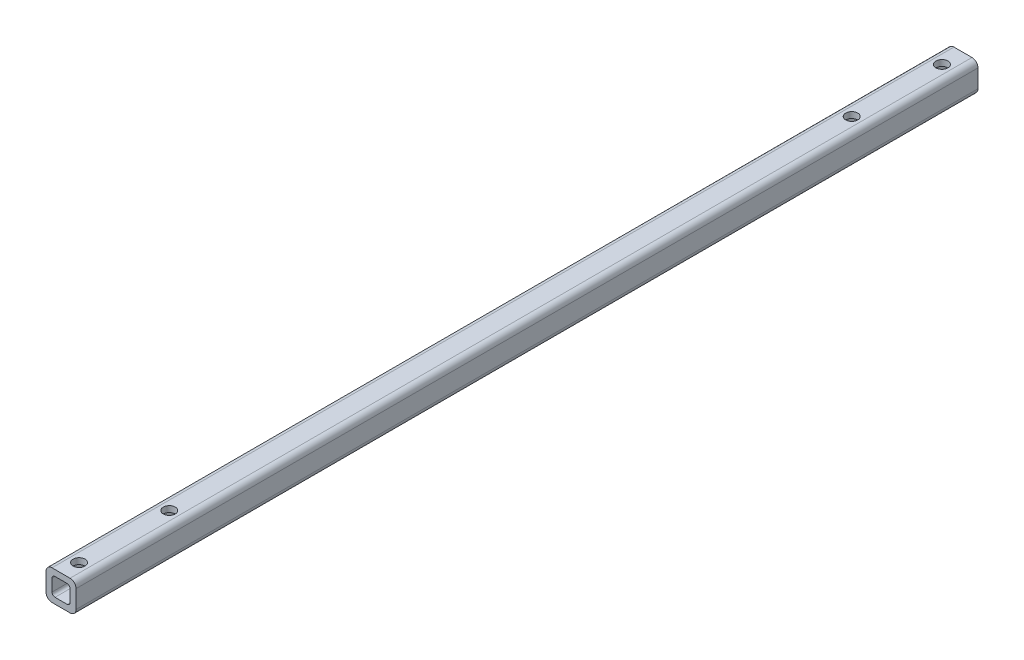
ISO-10303-21;
HEADER;
FILE_DESCRIPTION(('STEP AP214'),'2;1');
FILE_NAME('part.step','',(''),(''),'','','');
FILE_SCHEMA(('AUTOMOTIVE_DESIGN { 1 0 10303 214 1 1 1 1 }'));
ENDSEC;
DATA;
#1=APPLICATION_CONTEXT('core data for automotive mechanical design processes');
#2=APPLICATION_PROTOCOL_DEFINITION('international standard','automotive_design',2000,#1);
#3=PRODUCT_CONTEXT('',#1,'mechanical');
#4=PRODUCT('Part','Part','',(#3));
#5=PRODUCT_RELATED_PRODUCT_CATEGORY('part','',(#4));
#6=PRODUCT_DEFINITION_FORMATION('','',#4);
#7=PRODUCT_DEFINITION_CONTEXT('part definition',#1,'design');
#8=PRODUCT_DEFINITION('design','',#6,#7);
#9=PRODUCT_DEFINITION_SHAPE('','',#8);
#10=(LENGTH_UNIT() NAMED_UNIT(*) SI_UNIT(.MILLI.,.METRE.));
#11=(NAMED_UNIT(*) PLANE_ANGLE_UNIT() SI_UNIT($,.RADIAN.));
#12=(NAMED_UNIT(*) SI_UNIT($,.STERADIAN.) SOLID_ANGLE_UNIT());
#13=UNCERTAINTY_MEASURE_WITH_UNIT(LENGTH_MEASURE(1.E-05),#10,'distance_accuracy_value','');
#14=(GEOMETRIC_REPRESENTATION_CONTEXT(3) GLOBAL_UNCERTAINTY_ASSIGNED_CONTEXT((#13)) GLOBAL_UNIT_ASSIGNED_CONTEXT((#10,
#11,#12)) REPRESENTATION_CONTEXT('',''));
#15=CARTESIAN_POINT('',(0.,0.,0.));
#16=DIRECTION('',(0.,0.,1.));
#17=DIRECTION('',(1.,0.,0.));
#18=AXIS2_PLACEMENT_3D('',#15,#16,#17);
#19=CARTESIAN_POINT('',(3.00000000000001,8.,300.));
#20=DIRECTION('',(0.,-1.,0.));
#21=DIRECTION('',(0.,0.,-1.));
#22=AXIS2_PLACEMENT_3D('',#19,#20,#21);
#23=PLANE('',#22);
#24=CARTESIAN_POINT('',(5.,8.,37.));
#25=DIRECTION('',(0.,-1.,0.));
#26=DIRECTION('',(0.,0.,-1.));
#27=AXIS2_PLACEMENT_3D('',#24,#25,#26);
#28=CIRCLE('',#27,2.);
#29=CARTESIAN_POINT('',(6.99999999999999,8.,37.));
#30=VERTEX_POINT('',#29);
#31=CARTESIAN_POINT('',(3.00000000000001,8.,37.));
#32=VERTEX_POINT('',#31);
#33=EDGE_CURVE('E48',#30,#32,#28,.T.);
#34=ORIENTED_EDGE('',*,*,#33,.F.);
#35=DIRECTION('',(0.,0.,-1.));
#36=VECTOR('',#35,1.);
#37=CARTESIAN_POINT('',(6.99999999999999,8.,300.));
#38=LINE('',#37,#36);
#39=CARTESIAN_POINT('',(6.99999999999999,8.,264.));
#40=VERTEX_POINT('',#39);
#41=EDGE_CURVE('E391',#40,#30,#38,.T.);
#42=ORIENTED_EDGE('',*,*,#41,.F.);
#43=CARTESIAN_POINT('',(5.,8.,264.));
#44=DIRECTION('',(0.,-1.,0.));
#45=DIRECTION('',(0.,0.,-1.));
#46=AXIS2_PLACEMENT_3D('',#43,#44,#45);
#47=CIRCLE('',#46,2.);
#48=CARTESIAN_POINT('',(3.00000000000001,8.,264.));
#49=VERTEX_POINT('',#48);
#50=EDGE_CURVE('E292',#49,#40,#47,.T.);
#51=ORIENTED_EDGE('',*,*,#50,.F.);
#52=DIRECTION('',(0.,0.,-1.));
#53=VECTOR('',#52,1.);
#54=CARTESIAN_POINT('',(3.00000000000001,8.,300.));
#55=LINE('',#54,#53);
#56=EDGE_CURVE('E408',#49,#32,#55,.T.);
#57=ORIENTED_EDGE('',*,*,#56,.T.);
#58=EDGE_LOOP('',(#34,#42,#51,#57));
#59=FACE_BOUND('',#58,.T.);
#60=ADVANCED_FACE('F34',(#59),#23,.T.);
#61=CARTESIAN_POINT('',(3.00000000000001,2.,300.));
#62=DIRECTION('',(0.,1.,0.));
#63=DIRECTION('',(0.,0.,1.));
#64=AXIS2_PLACEMENT_3D('',#61,#62,#63);
#65=PLANE('',#64);
#66=CARTESIAN_POINT('',(5.,2.,37.));
#67=DIRECTION('',(0.,1.,0.));
#68=DIRECTION('',(0.,0.,1.));
#69=AXIS2_PLACEMENT_3D('',#66,#67,#68);
#70=CIRCLE('',#69,2.);
#71=CARTESIAN_POINT('',(6.99999999999999,2.,37.));
#72=VERTEX_POINT('',#71);
#73=CARTESIAN_POINT('',(3.00000000000001,2.,37.));
#74=VERTEX_POINT('',#73);
#75=EDGE_CURVE('E55',#72,#74,#70,.T.);
#76=ORIENTED_EDGE('',*,*,#75,.F.);
#77=DIRECTION('',(0.,0.,-1.));
#78=VECTOR('',#77,1.);
#79=CARTESIAN_POINT('',(6.99999999999999,2.,300.));
#80=LINE('',#79,#78);
#81=CARTESIAN_POINT('',(6.99999999999999,2.,7.00000000000001));
#82=VERTEX_POINT('',#81);
#83=EDGE_CURVE('E205',#72,#82,#80,.T.);
#84=ORIENTED_EDGE('',*,*,#83,.T.);
#85=CARTESIAN_POINT('',(5.,2.,7.));
#86=DIRECTION('',(0.,1.,0.));
#87=DIRECTION('',(0.,0.,1.));
#88=AXIS2_PLACEMENT_3D('',#85,#86,#87);
#89=CIRCLE('',#88,2.);
#90=CARTESIAN_POINT('',(3.00000000000001,2.,7.00000000000001));
#91=VERTEX_POINT('',#90);
#92=EDGE_CURVE('E301',#91,#82,#89,.T.);
#93=ORIENTED_EDGE('',*,*,#92,.F.);
#94=DIRECTION('',(0.,0.,-1.));
#95=VECTOR('',#94,1.);
#96=CARTESIAN_POINT('',(3.00000000000001,2.,300.));
#97=LINE('',#96,#95);
#98=EDGE_CURVE('E207',#74,#91,#97,.T.);
#99=ORIENTED_EDGE('',*,*,#98,.F.);
#100=EDGE_LOOP('',(#76,#84,#93,#99));
#101=FACE_BOUND('',#100,.T.);
#102=ADVANCED_FACE('F203',(#101),#65,.T.);
#103=EDGE_CURVE('E298',#82,#91,#89,.T.);
#104=ORIENTED_EDGE('',*,*,#103,.F.);
#105=CARTESIAN_POINT('',(6.99999999999999,2.,0.));
#106=VERTEX_POINT('',#105);
#107=EDGE_CURVE('E218',#82,#106,#80,.T.);
#108=ORIENTED_EDGE('',*,*,#107,.T.);
#109=DIRECTION('',(1.,0.,0.));
#110=VECTOR('',#109,1.);
#111=CARTESIAN_POINT('',(3.00000000000001,2.,0.));
#112=LINE('',#111,#110);
#113=CARTESIAN_POINT('',(3.00000000000001,2.,0.));
#114=VERTEX_POINT('',#113);
#115=EDGE_CURVE('E245',#114,#106,#112,.T.);
#116=ORIENTED_EDGE('',*,*,#115,.F.);
#117=EDGE_CURVE('E429',#91,#114,#97,.T.);
#118=ORIENTED_EDGE('',*,*,#117,.F.);
#119=EDGE_LOOP('',(#104,#108,#116,#118));
#120=FACE_BOUND('',#119,.T.);
#121=ADVANCED_FACE('F341',(#120),#65,.T.);
#122=EDGE_CURVE('E209',#32,#30,#28,.T.);
#123=ORIENTED_EDGE('',*,*,#122,.F.);
#124=CARTESIAN_POINT('',(3.00000000000001,8.,7.00000000000001));
#125=VERTEX_POINT('',#124);
#126=EDGE_CURVE('E407',#32,#125,#55,.T.);
#127=ORIENTED_EDGE('',*,*,#126,.T.);
#128=CARTESIAN_POINT('',(5.,8.,7.));
#129=DIRECTION('',(0.,-1.,0.));
#130=DIRECTION('',(0.,0.,-1.));
#131=AXIS2_PLACEMENT_3D('',#128,#129,#130);
#132=CIRCLE('',#131,2.);
#133=CARTESIAN_POINT('',(6.99999999999999,8.,7.));
#134=VERTEX_POINT('',#133);
#135=EDGE_CURVE('E303',#134,#125,#132,.T.);
#136=ORIENTED_EDGE('',*,*,#135,.F.);
#137=EDGE_CURVE('E396',#30,#134,#38,.T.);
#138=ORIENTED_EDGE('',*,*,#137,.F.);
#139=EDGE_LOOP('',(#123,#127,#136,#138));
#140=FACE_BOUND('',#139,.T.);
#141=ADVANCED_FACE('F336',(#140),#23,.T.);
#142=EDGE_CURVE('E192',#74,#72,#70,.T.);
#143=ORIENTED_EDGE('',*,*,#142,.F.);
#144=CARTESIAN_POINT('',(3.00000000000001,2.,264.));
#145=VERTEX_POINT('',#144);
#146=EDGE_CURVE('E428',#145,#74,#97,.T.);
#147=ORIENTED_EDGE('',*,*,#146,.F.);
#148=CARTESIAN_POINT('',(5.,2.,264.));
#149=DIRECTION('',(0.,1.,0.));
#150=DIRECTION('',(0.,0.,1.));
#151=AXIS2_PLACEMENT_3D('',#148,#149,#150);
#152=CIRCLE('',#151,2.);
#153=CARTESIAN_POINT('',(6.99999999999999,2.,264.));
#154=VERTEX_POINT('',#153);
#155=EDGE_CURVE('E223',#154,#145,#152,.T.);
#156=ORIENTED_EDGE('',*,*,#155,.F.);
#157=EDGE_CURVE('E216',#154,#72,#80,.T.);
#158=ORIENTED_EDGE('',*,*,#157,.T.);
#159=EDGE_LOOP('',(#143,#147,#156,#158));
#160=FACE_BOUND('',#159,.T.);
#161=ADVANCED_FACE('F222',(#160),#65,.T.);
#162=EDGE_CURVE('E291',#40,#49,#47,.T.);
#163=ORIENTED_EDGE('',*,*,#162,.F.);
#164=CARTESIAN_POINT('',(6.99999999999999,8.,294.));
#165=VERTEX_POINT('',#164);
#166=EDGE_CURVE('E386',#165,#40,#38,.T.);
#167=ORIENTED_EDGE('',*,*,#166,.F.);
#168=CARTESIAN_POINT('',(5.,8.,294.));
#169=DIRECTION('',(0.,-1.,0.));
#170=DIRECTION('',(0.,0.,-1.));
#171=AXIS2_PLACEMENT_3D('',#168,#169,#170);
#172=CIRCLE('',#171,2.);
#173=CARTESIAN_POINT('',(3.00000000000001,8.,294.));
#174=VERTEX_POINT('',#173);
#175=EDGE_CURVE('E278',#174,#165,#172,.T.);
#176=ORIENTED_EDGE('',*,*,#175,.F.);
#177=EDGE_CURVE('E406',#174,#49,#55,.T.);
#178=ORIENTED_EDGE('',*,*,#177,.T.);
#179=EDGE_LOOP('',(#163,#167,#176,#178));
#180=FACE_BOUND('',#179,.T.);
#181=ADVANCED_FACE('F348',(#180),#23,.T.);
#182=EDGE_CURVE('E263',#165,#174,#172,.T.);
#183=ORIENTED_EDGE('',*,*,#182,.F.);
#184=CARTESIAN_POINT('',(6.99999999999999,8.,300.));
#185=VERTEX_POINT('',#184);
#186=EDGE_CURVE('E378',#185,#165,#38,.T.);
#187=ORIENTED_EDGE('',*,*,#186,.F.);
#188=DIRECTION('',(-1.,0.,0.));
#189=VECTOR('',#188,1.);
#190=CARTESIAN_POINT('',(3.00000000000001,8.,300.));
#191=LINE('',#190,#189);
#192=CARTESIAN_POINT('',(3.00000000000001,8.,300.));
#193=VERTEX_POINT('',#192);
#194=EDGE_CURVE('E275',#185,#193,#191,.T.);
#195=ORIENTED_EDGE('',*,*,#194,.T.);
#196=EDGE_CURVE('E381',#193,#174,#55,.T.);
#197=ORIENTED_EDGE('',*,*,#196,.T.);
#198=EDGE_LOOP('',(#183,#187,#195,#197));
#199=FACE_BOUND('',#198,.T.);
#200=ADVANCED_FACE('F353',(#199),#23,.T.);
#201=EDGE_CURVE('E289',#145,#154,#152,.T.);
#202=ORIENTED_EDGE('',*,*,#201,.F.);
#203=CARTESIAN_POINT('',(3.00000000000001,2.,294.));
#204=VERTEX_POINT('',#203);
#205=EDGE_CURVE('E424',#204,#145,#97,.T.);
#206=ORIENTED_EDGE('',*,*,#205,.F.);
#207=CARTESIAN_POINT('',(5.,2.,294.));
#208=DIRECTION('',(0.,1.,0.));
#209=DIRECTION('',(0.,0.,1.));
#210=AXIS2_PLACEMENT_3D('',#207,#208,#209);
#211=CIRCLE('',#210,2.);
#212=CARTESIAN_POINT('',(6.99999999999999,2.,294.));
#213=VERTEX_POINT('',#212);
#214=EDGE_CURVE('E280',#213,#204,#211,.T.);
#215=ORIENTED_EDGE('',*,*,#214,.F.);
#216=EDGE_CURVE('E224',#213,#154,#80,.T.);
#217=ORIENTED_EDGE('',*,*,#216,.T.);
#218=EDGE_LOOP('',(#202,#206,#215,#217));
#219=FACE_BOUND('',#218,.T.);
#220=ADVANCED_FACE('F364',(#219),#65,.T.);
#221=CARTESIAN_POINT('',(8.,8.,300.));
#222=DIRECTION('',(0.,0.,-1.));
#223=DIRECTION('',(-1.,0.,0.));
#224=AXIS2_PLACEMENT_3D('',#221,#222,#223);
#225=PLANE('',#224);
#226=CARTESIAN_POINT('',(8.,8.,300.));
#227=DIRECTION('',(0.,0.,1.));
#228=DIRECTION('',(-1.,0.,0.));
#229=AXIS2_PLACEMENT_3D('',#226,#227,#228);
#230=CIRCLE('',#229,2.);
#231=CARTESIAN_POINT('',(10.,7.99999999999999,300.));
#232=VERTEX_POINT('',#231);
#233=CARTESIAN_POINT('',(7.99999999999999,10.,300.));
#234=VERTEX_POINT('',#233);
#235=EDGE_CURVE('E484',#232,#234,#230,.T.);
#236=ORIENTED_EDGE('',*,*,#235,.T.);
#237=DIRECTION('',(-1.,0.,0.));
#238=VECTOR('',#237,1.);
#239=CARTESIAN_POINT('',(2.00000000000001,10.,300.));
#240=LINE('',#239,#238);
#241=CARTESIAN_POINT('',(2.00000000000001,10.,300.));
#242=VERTEX_POINT('',#241);
#243=EDGE_CURVE('E526',#234,#242,#240,.T.);
#244=ORIENTED_EDGE('',*,*,#243,.T.);
#245=CARTESIAN_POINT('',(2.,8.,300.));
#246=DIRECTION('',(0.,0.,1.));
#247=DIRECTION('',(-1.,0.,0.));
#248=AXIS2_PLACEMENT_3D('',#245,#246,#247);
#249=CIRCLE('',#248,2.);
#250=CARTESIAN_POINT('',(0.,7.99999999999999,300.));
#251=VERTEX_POINT('',#250);
#252=EDGE_CURVE('E507',#242,#251,#249,.T.);
#253=ORIENTED_EDGE('',*,*,#252,.T.);
#254=DIRECTION('',(0.,-1.,0.));
#255=VECTOR('',#254,1.);
#256=CARTESIAN_POINT('',(0.,2.00000000000001,300.));
#257=LINE('',#256,#255);
#258=CARTESIAN_POINT('',(0.,2.00000000000001,300.));
#259=VERTEX_POINT('',#258);
#260=EDGE_CURVE('E521',#251,#259,#257,.T.);
#261=ORIENTED_EDGE('',*,*,#260,.T.);
#262=CARTESIAN_POINT('',(2.,2.,300.));
#263=DIRECTION('',(0.,0.,1.));
#264=DIRECTION('',(-1.,0.,0.));
#265=AXIS2_PLACEMENT_3D('',#262,#263,#264);
#266=CIRCLE('',#265,2.);
#267=CARTESIAN_POINT('',(2.00000000000001,0.,300.));
#268=VERTEX_POINT('',#267);
#269=EDGE_CURVE('E517',#259,#268,#266,.T.);
#270=ORIENTED_EDGE('',*,*,#269,.T.);
#271=DIRECTION('',(1.,0.,0.));
#272=VECTOR('',#271,1.);
#273=CARTESIAN_POINT('',(2.00000000000001,0.,300.));
#274=LINE('',#273,#272);
#275=CARTESIAN_POINT('',(7.99999999999999,0.,300.));
#276=VERTEX_POINT('',#275);
#277=EDGE_CURVE('E524',#268,#276,#274,.T.);
#278=ORIENTED_EDGE('',*,*,#277,.T.);
#279=CARTESIAN_POINT('',(8.,2.,300.));
#280=DIRECTION('',(0.,0.,1.));
#281=DIRECTION('',(1.,0.,0.));
#282=AXIS2_PLACEMENT_3D('',#279,#280,#281);
#283=CIRCLE('',#282,2.);
#284=CARTESIAN_POINT('',(10.,2.00000000000001,300.));
#285=VERTEX_POINT('',#284);
#286=EDGE_CURVE('E477',#276,#285,#283,.T.);
#287=ORIENTED_EDGE('',*,*,#286,.T.);
#288=DIRECTION('',(0.,1.,0.));
#289=VECTOR('',#288,1.);
#290=CARTESIAN_POINT('',(10.,2.00000000000001,300.));
#291=LINE('',#290,#289);
#292=EDGE_CURVE('E491',#285,#232,#291,.T.);
#293=ORIENTED_EDGE('',*,*,#292,.T.);
#294=EDGE_LOOP('',(#236,#244,#253,#261,#270,#278,#287,#293));
#295=FACE_BOUND('',#294,.T.);
#296=CARTESIAN_POINT('',(7.,7.,300.));
#297=DIRECTION('',(0.,0.,1.));
#298=DIRECTION('',(-1.,0.,0.));
#299=AXIS2_PLACEMENT_3D('',#296,#297,#298);
#300=CIRCLE('',#299,1.);
#301=CARTESIAN_POINT('',(8.,6.99999999999999,300.));
#302=VERTEX_POINT('',#301);
#303=EDGE_CURVE('E241',#302,#185,#300,.T.);
#304=ORIENTED_EDGE('',*,*,#303,.F.);
#305=DIRECTION('',(0.,1.,0.));
#306=VECTOR('',#305,1.);
#307=CARTESIAN_POINT('',(8.,6.99999999999999,300.));
#308=LINE('',#307,#306);
#309=CARTESIAN_POINT('',(8.,3.00000000000001,300.));
#310=VERTEX_POINT('',#309);
#311=EDGE_CURVE('E235',#310,#302,#308,.T.);
#312=ORIENTED_EDGE('',*,*,#311,.F.);
#313=CARTESIAN_POINT('',(7.,3.,300.));
#314=DIRECTION('',(0.,0.,1.));
#315=DIRECTION('',(1.,0.,0.));
#316=AXIS2_PLACEMENT_3D('',#313,#314,#315);
#317=CIRCLE('',#316,1.);
#318=CARTESIAN_POINT('',(6.99999999999999,2.,300.));
#319=VERTEX_POINT('',#318);
#320=EDGE_CURVE('E265',#319,#310,#317,.T.);
#321=ORIENTED_EDGE('',*,*,#320,.F.);
#322=DIRECTION('',(1.,0.,0.));
#323=VECTOR('',#322,1.);
#324=CARTESIAN_POINT('',(3.00000000000001,2.,300.));
#325=LINE('',#324,#323);
#326=CARTESIAN_POINT('',(3.00000000000001,2.,300.));
#327=VERTEX_POINT('',#326);
#328=EDGE_CURVE('E267',#327,#319,#325,.T.);
#329=ORIENTED_EDGE('',*,*,#328,.F.);
#330=CARTESIAN_POINT('',(3.,3.,300.));
#331=DIRECTION('',(0.,0.,1.));
#332=DIRECTION('',(1.,0.,0.));
#333=AXIS2_PLACEMENT_3D('',#330,#331,#332);
#334=CIRCLE('',#333,1.);
#335=CARTESIAN_POINT('',(2.,3.00000000000001,300.));
#336=VERTEX_POINT('',#335);
#337=EDGE_CURVE('E269',#336,#327,#334,.T.);
#338=ORIENTED_EDGE('',*,*,#337,.F.);
#339=DIRECTION('',(0.,-1.,0.));
#340=VECTOR('',#339,1.);
#341=CARTESIAN_POINT('',(2.,6.99999999999999,300.));
#342=LINE('',#341,#340);
#343=CARTESIAN_POINT('',(2.,6.99999999999999,300.));
#344=VERTEX_POINT('',#343);
#345=EDGE_CURVE('E271',#344,#336,#342,.T.);
#346=ORIENTED_EDGE('',*,*,#345,.F.);
#347=CARTESIAN_POINT('',(3.,7.,300.));
#348=DIRECTION('',(0.,0.,1.));
#349=DIRECTION('',(1.,0.,0.));
#350=AXIS2_PLACEMENT_3D('',#347,#348,#349);
#351=CIRCLE('',#350,1.);
#352=EDGE_CURVE('E273',#193,#344,#351,.T.);
#353=ORIENTED_EDGE('',*,*,#352,.F.);
#354=ORIENTED_EDGE('',*,*,#194,.F.);
#355=EDGE_LOOP('',(#304,#312,#321,#329,#338,#346,#353,#354));
#356=FACE_BOUND('',#355,.T.);
#357=ADVANCED_FACE('F370',(#295,#356),#225,.F.);
#358=CARTESIAN_POINT('',(8.,8.,0.));
#359=DIRECTION('',(0.,0.,-1.));
#360=DIRECTION('',(-1.,0.,0.));
#361=AXIS2_PLACEMENT_3D('',#358,#359,#360);
#362=PLANE('',#361);
#363=CARTESIAN_POINT('',(8.,8.,0.));
#364=DIRECTION('',(0.,0.,1.));
#365=DIRECTION('',(-1.,0.,0.));
#366=AXIS2_PLACEMENT_3D('',#363,#364,#365);
#367=CIRCLE('',#366,2.);
#368=CARTESIAN_POINT('',(10.,7.99999999999999,0.));
#369=VERTEX_POINT('',#368);
#370=CARTESIAN_POINT('',(7.99999999999999,10.,0.));
#371=VERTEX_POINT('',#370);
#372=EDGE_CURVE('E395',#369,#371,#367,.T.);
#373=ORIENTED_EDGE('',*,*,#372,.F.);
#374=DIRECTION('',(0.,1.,0.));
#375=VECTOR('',#374,1.);
#376=CARTESIAN_POINT('',(10.,2.00000000000001,0.));
#377=LINE('',#376,#375);
#378=CARTESIAN_POINT('',(10.,2.00000000000001,0.));
#379=VERTEX_POINT('',#378);
#380=EDGE_CURVE('E482',#379,#369,#377,.T.);
#381=ORIENTED_EDGE('',*,*,#380,.F.);
#382=CARTESIAN_POINT('',(8.,2.,0.));
#383=DIRECTION('',(0.,0.,1.));
#384=DIRECTION('',(1.,0.,0.));
#385=AXIS2_PLACEMENT_3D('',#382,#383,#384);
#386=CIRCLE('',#385,2.);
#387=CARTESIAN_POINT('',(7.99999999999999,0.,0.));
#388=VERTEX_POINT('',#387);
#389=EDGE_CURVE('E471',#388,#379,#386,.T.);
#390=ORIENTED_EDGE('',*,*,#389,.F.);
#391=DIRECTION('',(1.,0.,0.));
#392=VECTOR('',#391,1.);
#393=CARTESIAN_POINT('',(2.00000000000001,0.,0.));
#394=LINE('',#393,#392);
#395=CARTESIAN_POINT('',(2.00000000000001,0.,0.));
#396=VERTEX_POINT('',#395);
#397=EDGE_CURVE('E461',#396,#388,#394,.T.);
#398=ORIENTED_EDGE('',*,*,#397,.F.);
#399=CARTESIAN_POINT('',(2.,2.,0.));
#400=DIRECTION('',(0.,0.,1.));
#401=DIRECTION('',(-1.,0.,0.));
#402=AXIS2_PLACEMENT_3D('',#399,#400,#401);
#403=CIRCLE('',#402,2.);
#404=CARTESIAN_POINT('',(0.,2.00000000000001,0.));
#405=VERTEX_POINT('',#404);
#406=EDGE_CURVE('E472',#405,#396,#403,.T.);
#407=ORIENTED_EDGE('',*,*,#406,.F.);
#408=DIRECTION('',(0.,-1.,0.));
#409=VECTOR('',#408,1.);
#410=CARTESIAN_POINT('',(0.,2.00000000000001,0.));
#411=LINE('',#410,#409);
#412=CARTESIAN_POINT('',(0.,7.99999999999999,0.));
#413=VERTEX_POINT('',#412);
#414=EDGE_CURVE('E510',#413,#405,#411,.T.);
#415=ORIENTED_EDGE('',*,*,#414,.F.);
#416=CARTESIAN_POINT('',(2.,8.,0.));
#417=DIRECTION('',(0.,0.,1.));
#418=DIRECTION('',(-1.,0.,0.));
#419=AXIS2_PLACEMENT_3D('',#416,#417,#418);
#420=CIRCLE('',#419,2.);
#421=CARTESIAN_POINT('',(2.00000000000001,10.,0.));
#422=VERTEX_POINT('',#421);
#423=EDGE_CURVE('E506',#422,#413,#420,.T.);
#424=ORIENTED_EDGE('',*,*,#423,.F.);
#425=DIRECTION('',(-1.,0.,0.));
#426=VECTOR('',#425,1.);
#427=CARTESIAN_POINT('',(2.00000000000001,10.,0.));
#428=LINE('',#427,#426);
#429=EDGE_CURVE('E398',#371,#422,#428,.T.);
#430=ORIENTED_EDGE('',*,*,#429,.F.);
#431=EDGE_LOOP('',(#373,#381,#390,#398,#407,#415,#424,#430));
#432=FACE_BOUND('',#431,.T.);
#433=DIRECTION('',(0.,1.,0.));
#434=VECTOR('',#433,1.);
#435=CARTESIAN_POINT('',(8.,6.99999999999999,0.));
#436=LINE('',#435,#434);
#437=CARTESIAN_POINT('',(8.,3.00000000000001,0.));
#438=VERTEX_POINT('',#437);
#439=CARTESIAN_POINT('',(8.,6.99999999999999,0.));
#440=VERTEX_POINT('',#439);
#441=EDGE_CURVE('E238',#438,#440,#436,.T.);
#442=ORIENTED_EDGE('',*,*,#441,.T.);
#443=CARTESIAN_POINT('',(7.,7.,0.));
#444=DIRECTION('',(0.,0.,1.));
#445=DIRECTION('',(-1.,0.,0.));
#446=AXIS2_PLACEMENT_3D('',#443,#444,#445);
#447=CIRCLE('',#446,1.);
#448=CARTESIAN_POINT('',(6.99999999999999,8.,0.));
#449=VERTEX_POINT('',#448);
#450=EDGE_CURVE('E260',#440,#449,#447,.T.);
#451=ORIENTED_EDGE('',*,*,#450,.T.);
#452=DIRECTION('',(-1.,0.,0.));
#453=VECTOR('',#452,1.);
#454=CARTESIAN_POINT('',(3.00000000000001,8.,0.));
#455=LINE('',#454,#453);
#456=CARTESIAN_POINT('',(3.00000000000001,8.,0.));
#457=VERTEX_POINT('',#456);
#458=EDGE_CURVE('E257',#449,#457,#455,.T.);
#459=ORIENTED_EDGE('',*,*,#458,.T.);
#460=CARTESIAN_POINT('',(3.,7.,0.));
#461=DIRECTION('',(0.,0.,1.));
#462=DIRECTION('',(1.,0.,0.));
#463=AXIS2_PLACEMENT_3D('',#460,#461,#462);
#464=CIRCLE('',#463,1.);
#465=CARTESIAN_POINT('',(2.,6.99999999999999,0.));
#466=VERTEX_POINT('',#465);
#467=EDGE_CURVE('E254',#457,#466,#464,.T.);
#468=ORIENTED_EDGE('',*,*,#467,.T.);
#469=DIRECTION('',(0.,-1.,0.));
#470=VECTOR('',#469,1.);
#471=CARTESIAN_POINT('',(2.,6.99999999999999,0.));
#472=LINE('',#471,#470);
#473=CARTESIAN_POINT('',(2.,3.00000000000001,0.));
#474=VERTEX_POINT('',#473);
#475=EDGE_CURVE('E251',#466,#474,#472,.T.);
#476=ORIENTED_EDGE('',*,*,#475,.T.);
#477=CARTESIAN_POINT('',(3.,3.,0.));
#478=DIRECTION('',(0.,0.,1.));
#479=DIRECTION('',(1.,0.,0.));
#480=AXIS2_PLACEMENT_3D('',#477,#478,#479);
#481=CIRCLE('',#480,1.);
#482=EDGE_CURVE('E248',#474,#114,#481,.T.);
#483=ORIENTED_EDGE('',*,*,#482,.T.);
#484=ORIENTED_EDGE('',*,*,#115,.T.);
#485=CARTESIAN_POINT('',(7.,3.,0.));
#486=DIRECTION('',(0.,0.,1.));
#487=DIRECTION('',(1.,0.,0.));
#488=AXIS2_PLACEMENT_3D('',#485,#486,#487);
#489=CIRCLE('',#488,1.);
#490=EDGE_CURVE('E242',#106,#438,#489,.T.);
#491=ORIENTED_EDGE('',*,*,#490,.T.);
#492=EDGE_LOOP('',(#442,#451,#459,#468,#476,#483,#484,#491));
#493=FACE_BOUND('',#492,.T.);
#494=ADVANCED_FACE('F446',(#432,#493),#362,.T.);
#495=CARTESIAN_POINT('',(8.,8.,300.));
#496=DIRECTION('',(0.,0.,-1.));
#497=DIRECTION('',(-1.,0.,0.));
#498=AXIS2_PLACEMENT_3D('',#495,#496,#497);
#499=CYLINDRICAL_SURFACE('',#498,2.);
#500=ORIENTED_EDGE('',*,*,#372,.T.);
#501=DIRECTION('',(0.,0.,-1.));
#502=VECTOR('',#501,1.);
#503=CARTESIAN_POINT('',(7.99999999999999,10.,300.));
#504=LINE('',#503,#502);
#505=EDGE_CURVE('E11',#234,#371,#504,.T.);
#506=ORIENTED_EDGE('',*,*,#505,.F.);
#507=ORIENTED_EDGE('',*,*,#235,.F.);
#508=DIRECTION('',(0.,0.,-1.));
#509=VECTOR('',#508,1.);
#510=CARTESIAN_POINT('',(10.,7.99999999999999,300.));
#511=LINE('',#510,#509);
#512=EDGE_CURVE('E488',#232,#369,#511,.T.);
#513=ORIENTED_EDGE('',*,*,#512,.T.);
#514=EDGE_LOOP('',(#500,#506,#507,#513));
#515=FACE_BOUND('',#514,.T.);
#516=ADVANCED_FACE('F36',(#515),#499,.T.);
#517=CARTESIAN_POINT('',(2.00000000000001,10.,300.));
#518=DIRECTION('',(0.,-1.,0.));
#519=DIRECTION('',(0.,0.,-1.));
#520=AXIS2_PLACEMENT_3D('',#517,#518,#519);
#521=PLANE('',#520);
#522=CARTESIAN_POINT('',(5.,10.,37.));
#523=DIRECTION('',(0.,1.,0.));
#524=DIRECTION('',(0.,0.,1.));
#525=AXIS2_PLACEMENT_3D('',#522,#523,#524);
#526=CIRCLE('',#525,2.);
#527=CARTESIAN_POINT('',(5.,10.,39.));
#528=VERTEX_POINT('',#527);
#529=EDGE_CURVE('E314',#528,#528,#526,.T.);
#530=ORIENTED_EDGE('',*,*,#529,.F.);
#531=EDGE_LOOP('',(#530));
#532=FACE_BOUND('',#531,.T.);
#533=CARTESIAN_POINT('',(5.,10.,7.));
#534=DIRECTION('',(0.,1.,0.));
#535=DIRECTION('',(0.,0.,1.));
#536=AXIS2_PLACEMENT_3D('',#533,#534,#535);
#537=CIRCLE('',#536,2.);
#538=CARTESIAN_POINT('',(5.,10.,9.));
#539=VERTEX_POINT('',#538);
#540=EDGE_CURVE('E308',#539,#539,#537,.T.);
#541=ORIENTED_EDGE('',*,*,#540,.F.);
#542=EDGE_LOOP('',(#541));
#543=FACE_BOUND('',#542,.T.);
#544=CARTESIAN_POINT('',(5.,10.,264.));
#545=DIRECTION('',(0.,1.,0.));
#546=DIRECTION('',(0.,0.,1.));
#547=AXIS2_PLACEMENT_3D('',#544,#545,#546);
#548=CIRCLE('',#547,2.);
#549=CARTESIAN_POINT('',(5.,10.,266.));
#550=VERTEX_POINT('',#549);
#551=EDGE_CURVE('E295',#550,#550,#548,.T.);
#552=ORIENTED_EDGE('',*,*,#551,.F.);
#553=EDGE_LOOP('',(#552));
#554=FACE_BOUND('',#553,.T.);
#555=CARTESIAN_POINT('',(5.,10.,294.));
#556=DIRECTION('',(0.,1.,0.));
#557=DIRECTION('',(0.,0.,1.));
#558=AXIS2_PLACEMENT_3D('',#555,#556,#557);
#559=CIRCLE('',#558,2.);
#560=CARTESIAN_POINT('',(5.,10.,296.));
#561=VERTEX_POINT('',#560);
#562=EDGE_CURVE('E284',#561,#561,#559,.T.);
#563=ORIENTED_EDGE('',*,*,#562,.F.);
#564=EDGE_LOOP('',(#563));
#565=FACE_BOUND('',#564,.T.);
#566=ORIENTED_EDGE('',*,*,#429,.T.);
#567=DIRECTION('',(0.,0.,-1.));
#568=VECTOR('',#567,1.);
#569=CARTESIAN_POINT('',(2.00000000000001,10.,300.));
#570=LINE('',#569,#568);
#571=EDGE_CURVE('E42',#242,#422,#570,.T.);
#572=ORIENTED_EDGE('',*,*,#571,.F.);
#573=ORIENTED_EDGE('',*,*,#243,.F.);
#574=ORIENTED_EDGE('',*,*,#505,.T.);
#575=EDGE_LOOP('',(#566,#572,#573,#574));
#576=FACE_BOUND('',#575,.T.);
#577=ADVANCED_FACE('F539',(#532,#543,#554,#565,#576),#521,.F.);
#578=CARTESIAN_POINT('',(2.,8.,300.));
#579=DIRECTION('',(0.,0.,-1.));
#580=DIRECTION('',(-1.,0.,0.));
#581=AXIS2_PLACEMENT_3D('',#578,#579,#580);
#582=CYLINDRICAL_SURFACE('',#581,2.);
#583=ORIENTED_EDGE('',*,*,#423,.T.);
#584=DIRECTION('',(0.,0.,-1.));
#585=VECTOR('',#584,1.);
#586=CARTESIAN_POINT('',(0.,7.99999999999999,300.));
#587=LINE('',#586,#585);
#588=EDGE_CURVE('E497',#251,#413,#587,.T.);
#589=ORIENTED_EDGE('',*,*,#588,.F.);
#590=ORIENTED_EDGE('',*,*,#252,.F.);
#591=ORIENTED_EDGE('',*,*,#571,.T.);
#592=EDGE_LOOP('',(#583,#589,#590,#591));
#593=FACE_BOUND('',#592,.T.);
#594=ADVANCED_FACE('F504',(#593),#582,.T.);
#595=CARTESIAN_POINT('',(0.,2.00000000000001,300.));
#596=DIRECTION('',(1.,0.,0.));
#597=DIRECTION('',(0.,0.,-1.));
#598=AXIS2_PLACEMENT_3D('',#595,#596,#597);
#599=PLANE('',#598);
#600=ORIENTED_EDGE('',*,*,#414,.T.);
#601=DIRECTION('',(0.,0.,-1.));
#602=VECTOR('',#601,1.);
#603=CARTESIAN_POINT('',(0.,2.00000000000001,300.));
#604=LINE('',#603,#602);
#605=EDGE_CURVE('E494',#259,#405,#604,.T.);
#606=ORIENTED_EDGE('',*,*,#605,.F.);
#607=ORIENTED_EDGE('',*,*,#260,.F.);
#608=ORIENTED_EDGE('',*,*,#588,.T.);
#609=EDGE_LOOP('',(#600,#606,#607,#608));
#610=FACE_BOUND('',#609,.T.);
#611=ADVANCED_FACE('F520',(#610),#599,.F.);
#612=CARTESIAN_POINT('',(2.,2.,300.));
#613=DIRECTION('',(0.,0.,-1.));
#614=DIRECTION('',(-1.,0.,0.));
#615=AXIS2_PLACEMENT_3D('',#612,#613,#614);
#616=CYLINDRICAL_SURFACE('',#615,2.);
#617=ORIENTED_EDGE('',*,*,#406,.T.);
#618=DIRECTION('',(0.,0.,-1.));
#619=VECTOR('',#618,1.);
#620=CARTESIAN_POINT('',(2.00000000000001,0.,300.));
#621=LINE('',#620,#619);
#622=EDGE_CURVE('E467',#268,#396,#621,.T.);
#623=ORIENTED_EDGE('',*,*,#622,.F.);
#624=ORIENTED_EDGE('',*,*,#269,.F.);
#625=ORIENTED_EDGE('',*,*,#605,.T.);
#626=EDGE_LOOP('',(#617,#623,#624,#625));
#627=FACE_BOUND('',#626,.T.);
#628=ADVANCED_FACE('F452',(#627),#616,.T.);
#629=CARTESIAN_POINT('',(2.00000000000001,0.,300.));
#630=DIRECTION('',(0.,1.,0.));
#631=DIRECTION('',(0.,0.,1.));
#632=AXIS2_PLACEMENT_3D('',#629,#630,#631);
#633=PLANE('',#632);
#634=CARTESIAN_POINT('',(5.,0.,37.));
#635=DIRECTION('',(0.,1.,0.));
#636=DIRECTION('',(0.,0.,1.));
#637=AXIS2_PLACEMENT_3D('',#634,#635,#636);
#638=CIRCLE('',#637,2.);
#639=CARTESIAN_POINT('',(5.,0.,39.));
#640=VERTEX_POINT('',#639);
#641=EDGE_CURVE('E199',#640,#640,#638,.T.);
#642=ORIENTED_EDGE('',*,*,#641,.T.);
#643=EDGE_LOOP('',(#642));
#644=FACE_BOUND('',#643,.T.);
#645=CARTESIAN_POINT('',(5.,0.,7.));
#646=DIRECTION('',(0.,1.,0.));
#647=DIRECTION('',(0.,0.,1.));
#648=AXIS2_PLACEMENT_3D('',#645,#646,#647);
#649=CIRCLE('',#648,2.);
#650=CARTESIAN_POINT('',(5.,0.,9.));
#651=VERTEX_POINT('',#650);
#652=EDGE_CURVE('E307',#651,#651,#649,.T.);
#653=ORIENTED_EDGE('',*,*,#652,.T.);
#654=EDGE_LOOP('',(#653));
#655=FACE_BOUND('',#654,.T.);
#656=CARTESIAN_POINT('',(5.,0.,264.));
#657=DIRECTION('',(0.,1.,0.));
#658=DIRECTION('',(0.,0.,1.));
#659=AXIS2_PLACEMENT_3D('',#656,#657,#658);
#660=CIRCLE('',#659,2.);
#661=CARTESIAN_POINT('',(5.,0.,266.));
#662=VERTEX_POINT('',#661);
#663=EDGE_CURVE('E294',#662,#662,#660,.T.);
#664=ORIENTED_EDGE('',*,*,#663,.T.);
#665=EDGE_LOOP('',(#664));
#666=FACE_BOUND('',#665,.T.);
#667=CARTESIAN_POINT('',(5.,0.,294.));
#668=DIRECTION('',(0.,1.,0.));
#669=DIRECTION('',(0.,0.,1.));
#670=AXIS2_PLACEMENT_3D('',#667,#668,#669);
#671=CIRCLE('',#670,2.);
#672=CARTESIAN_POINT('',(5.,0.,296.));
#673=VERTEX_POINT('',#672);
#674=EDGE_CURVE('E283',#673,#673,#671,.T.);
#675=ORIENTED_EDGE('',*,*,#674,.T.);
#676=EDGE_LOOP('',(#675));
#677=FACE_BOUND('',#676,.T.);
#678=ORIENTED_EDGE('',*,*,#397,.T.);
#679=DIRECTION('',(0.,0.,-1.));
#680=VECTOR('',#679,1.);
#681=CARTESIAN_POINT('',(7.99999999999999,0.,300.));
#682=LINE('',#681,#680);
#683=EDGE_CURVE('E464',#276,#388,#682,.T.);
#684=ORIENTED_EDGE('',*,*,#683,.F.);
#685=ORIENTED_EDGE('',*,*,#277,.F.);
#686=ORIENTED_EDGE('',*,*,#622,.T.);
#687=EDGE_LOOP('',(#678,#684,#685,#686));
#688=FACE_BOUND('',#687,.T.);
#689=ADVANCED_FACE('F320',(#644,#655,#666,#677,#688),#633,.F.);
#690=CARTESIAN_POINT('',(8.,2.,300.));
#691=DIRECTION('',(0.,0.,-1.));
#692=DIRECTION('',(-1.,0.,0.));
#693=AXIS2_PLACEMENT_3D('',#690,#691,#692);
#694=CYLINDRICAL_SURFACE('',#693,2.);
#695=ORIENTED_EDGE('',*,*,#389,.T.);
#696=DIRECTION('',(0.,0.,-1.));
#697=VECTOR('',#696,1.);
#698=CARTESIAN_POINT('',(10.,2.00000000000001,300.));
#699=LINE('',#698,#697);
#700=EDGE_CURVE('E478',#285,#379,#699,.T.);
#701=ORIENTED_EDGE('',*,*,#700,.F.);
#702=ORIENTED_EDGE('',*,*,#286,.F.);
#703=ORIENTED_EDGE('',*,*,#683,.T.);
#704=EDGE_LOOP('',(#695,#701,#702,#703));
#705=FACE_BOUND('',#704,.T.);
#706=ADVANCED_FACE('F451',(#705),#694,.T.);
#707=CARTESIAN_POINT('',(10.,2.00000000000001,300.));
#708=DIRECTION('',(-1.,0.,0.));
#709=DIRECTION('',(0.,0.,1.));
#710=AXIS2_PLACEMENT_3D('',#707,#708,#709);
#711=PLANE('',#710);
#712=ORIENTED_EDGE('',*,*,#380,.T.);
#713=ORIENTED_EDGE('',*,*,#512,.F.);
#714=ORIENTED_EDGE('',*,*,#292,.F.);
#715=ORIENTED_EDGE('',*,*,#700,.T.);
#716=EDGE_LOOP('',(#712,#713,#714,#715));
#717=FACE_BOUND('',#716,.T.);
#718=ADVANCED_FACE('F360',(#717),#711,.F.);
#719=CARTESIAN_POINT('',(7.,7.,300.));
#720=DIRECTION('',(0.,0.,-1.));
#721=DIRECTION('',(-1.,0.,0.));
#722=AXIS2_PLACEMENT_3D('',#719,#720,#721);
#723=CYLINDRICAL_SURFACE('',#722,1.);
#724=ORIENTED_EDGE('',*,*,#450,.F.);
#725=DIRECTION('',(0.,0.,-1.));
#726=VECTOR('',#725,1.);
#727=CARTESIAN_POINT('',(8.,6.99999999999999,300.));
#728=LINE('',#727,#726);
#729=EDGE_CURVE('E231',#302,#440,#728,.T.);
#730=ORIENTED_EDGE('',*,*,#729,.F.);
#731=ORIENTED_EDGE('',*,*,#303,.T.);
#732=ORIENTED_EDGE('',*,*,#186,.T.);
#733=ORIENTED_EDGE('',*,*,#166,.T.);
#734=ORIENTED_EDGE('',*,*,#41,.T.);
#735=ORIENTED_EDGE('',*,*,#137,.T.);
#736=EDGE_CURVE('E402',#134,#449,#38,.T.);
#737=ORIENTED_EDGE('',*,*,#736,.T.);
#738=EDGE_LOOP('',(#724,#730,#731,#732,#733,#734,#735,#737));
#739=FACE_BOUND('',#738,.T.);
#740=ADVANCED_FACE('F351',(#739),#723,.F.);
#741=EDGE_CURVE('E304',#125,#134,#132,.T.);
#742=ORIENTED_EDGE('',*,*,#741,.F.);
#743=EDGE_CURVE('E410',#125,#457,#55,.T.);
#744=ORIENTED_EDGE('',*,*,#743,.T.);
#745=ORIENTED_EDGE('',*,*,#458,.F.);
#746=ORIENTED_EDGE('',*,*,#736,.F.);
#747=EDGE_LOOP('',(#742,#744,#745,#746));
#748=FACE_BOUND('',#747,.T.);
#749=ADVANCED_FACE('F337',(#748),#23,.T.);
#750=CARTESIAN_POINT('',(3.,7.,300.));
#751=DIRECTION('',(0.,0.,-1.));
#752=DIRECTION('',(-1.,0.,0.));
#753=AXIS2_PLACEMENT_3D('',#750,#751,#752);
#754=CYLINDRICAL_SURFACE('',#753,1.);
#755=ORIENTED_EDGE('',*,*,#467,.F.);
#756=ORIENTED_EDGE('',*,*,#743,.F.);
#757=ORIENTED_EDGE('',*,*,#126,.F.);
#758=ORIENTED_EDGE('',*,*,#56,.F.);
#759=ORIENTED_EDGE('',*,*,#177,.F.);
#760=ORIENTED_EDGE('',*,*,#196,.F.);
#761=ORIENTED_EDGE('',*,*,#352,.T.);
#762=DIRECTION('',(0.,0.,-1.));
#763=VECTOR('',#762,1.);
#764=CARTESIAN_POINT('',(2.,6.99999999999999,300.));
#765=LINE('',#764,#763);
#766=EDGE_CURVE('E415',#344,#466,#765,.T.);
#767=ORIENTED_EDGE('',*,*,#766,.T.);
#768=EDGE_LOOP('',(#755,#756,#757,#758,#759,#760,#761,#767));
#769=FACE_BOUND('',#768,.T.);
#770=ADVANCED_FACE('F350',(#769),#754,.F.);
#771=CARTESIAN_POINT('',(2.,6.99999999999999,300.));
#772=DIRECTION('',(1.,0.,0.));
#773=DIRECTION('',(0.,1.,0.));
#774=AXIS2_PLACEMENT_3D('',#771,#772,#773);
#775=PLANE('',#774);
#776=ORIENTED_EDGE('',*,*,#475,.F.);
#777=ORIENTED_EDGE('',*,*,#766,.F.);
#778=ORIENTED_EDGE('',*,*,#345,.T.);
#779=DIRECTION('',(0.,0.,-1.));
#780=VECTOR('',#779,1.);
#781=CARTESIAN_POINT('',(2.,3.00000000000001,300.));
#782=LINE('',#781,#780);
#783=EDGE_CURVE('E418',#336,#474,#782,.T.);
#784=ORIENTED_EDGE('',*,*,#783,.T.);
#785=EDGE_LOOP('',(#776,#777,#778,#784));
#786=FACE_BOUND('',#785,.T.);
#787=ADVANCED_FACE('F358',(#786),#775,.T.);
#788=CARTESIAN_POINT('',(3.,3.,300.));
#789=DIRECTION('',(0.,0.,-1.));
#790=DIRECTION('',(-1.,0.,0.));
#791=AXIS2_PLACEMENT_3D('',#788,#789,#790);
#792=CYLINDRICAL_SURFACE('',#791,1.);
#793=ORIENTED_EDGE('',*,*,#482,.F.);
#794=ORIENTED_EDGE('',*,*,#783,.F.);
#795=ORIENTED_EDGE('',*,*,#337,.T.);
#796=EDGE_CURVE('E421',#327,#204,#97,.T.);
#797=ORIENTED_EDGE('',*,*,#796,.T.);
#798=ORIENTED_EDGE('',*,*,#205,.T.);
#799=ORIENTED_EDGE('',*,*,#146,.T.);
#800=ORIENTED_EDGE('',*,*,#98,.T.);
#801=ORIENTED_EDGE('',*,*,#117,.T.);
#802=EDGE_LOOP('',(#793,#794,#795,#797,#798,#799,#800,#801));
#803=FACE_BOUND('',#802,.T.);
#804=ADVANCED_FACE('F615',(#803),#792,.F.);
#805=EDGE_CURVE('E281',#204,#213,#211,.T.);
#806=ORIENTED_EDGE('',*,*,#805,.F.);
#807=ORIENTED_EDGE('',*,*,#796,.F.);
#808=ORIENTED_EDGE('',*,*,#328,.T.);
#809=EDGE_CURVE('E220',#319,#213,#80,.T.);
#810=ORIENTED_EDGE('',*,*,#809,.T.);
#811=EDGE_LOOP('',(#806,#807,#808,#810));
#812=FACE_BOUND('',#811,.T.);
#813=ADVANCED_FACE('F343',(#812),#65,.T.);
#814=CARTESIAN_POINT('',(7.,3.,300.));
#815=DIRECTION('',(0.,0.,-1.));
#816=DIRECTION('',(-1.,0.,0.));
#817=AXIS2_PLACEMENT_3D('',#814,#815,#816);
#818=CYLINDRICAL_SURFACE('',#817,1.);
#819=ORIENTED_EDGE('',*,*,#490,.F.);
#820=ORIENTED_EDGE('',*,*,#107,.F.);
#821=ORIENTED_EDGE('',*,*,#83,.F.);
#822=ORIENTED_EDGE('',*,*,#157,.F.);
#823=ORIENTED_EDGE('',*,*,#216,.F.);
#824=ORIENTED_EDGE('',*,*,#809,.F.);
#825=ORIENTED_EDGE('',*,*,#320,.T.);
#826=DIRECTION('',(0.,0.,-1.));
#827=VECTOR('',#826,1.);
#828=CARTESIAN_POINT('',(8.,3.00000000000001,300.));
#829=LINE('',#828,#827);
#830=EDGE_CURVE('E227',#310,#438,#829,.T.);
#831=ORIENTED_EDGE('',*,*,#830,.T.);
#832=EDGE_LOOP('',(#819,#820,#821,#822,#823,#824,#825,#831));
#833=FACE_BOUND('',#832,.T.);
#834=ADVANCED_FACE('F214',(#833),#818,.F.);
#835=CARTESIAN_POINT('',(8.,6.99999999999999,300.));
#836=DIRECTION('',(-1.,0.,0.));
#837=DIRECTION('',(0.,0.,1.));
#838=AXIS2_PLACEMENT_3D('',#835,#836,#837);
#839=PLANE('',#838);
#840=ORIENTED_EDGE('',*,*,#441,.F.);
#841=ORIENTED_EDGE('',*,*,#830,.F.);
#842=ORIENTED_EDGE('',*,*,#311,.T.);
#843=ORIENTED_EDGE('',*,*,#729,.T.);
#844=EDGE_LOOP('',(#840,#841,#842,#843));
#845=FACE_BOUND('',#844,.T.);
#846=ADVANCED_FACE('F444',(#845),#839,.T.);
#847=CARTESIAN_POINT('',(5.,0.,294.));
#848=DIRECTION('',(0.,1.,0.));
#849=DIRECTION('',(0.,0.,1.));
#850=AXIS2_PLACEMENT_3D('',#847,#848,#849);
#851=CYLINDRICAL_SURFACE('',#850,2.);
#852=ORIENTED_EDGE('',*,*,#214,.T.);
#853=ORIENTED_EDGE('',*,*,#805,.T.);
#854=EDGE_LOOP('',(#852,#853));
#855=FACE_BOUND('',#854,.T.);
#856=ORIENTED_EDGE('',*,*,#674,.F.);
#857=EDGE_LOOP('',(#856));
#858=FACE_BOUND('',#857,.T.);
#859=ADVANCED_FACE('F627',(#855,#858),#851,.F.);
#860=ORIENTED_EDGE('',*,*,#182,.T.);
#861=ORIENTED_EDGE('',*,*,#175,.T.);
#862=EDGE_LOOP('',(#860,#861));
#863=FACE_BOUND('',#862,.T.);
#864=ORIENTED_EDGE('',*,*,#562,.T.);
#865=EDGE_LOOP('',(#864));
#866=FACE_BOUND('',#865,.T.);
#867=ADVANCED_FACE('F724',(#863,#866),#851,.F.);
#868=CARTESIAN_POINT('',(5.,0.,264.));
#869=DIRECTION('',(0.,1.,0.));
#870=DIRECTION('',(0.,0.,1.));
#871=AXIS2_PLACEMENT_3D('',#868,#869,#870);
#872=CYLINDRICAL_SURFACE('',#871,2.);
#873=ORIENTED_EDGE('',*,*,#162,.T.);
#874=ORIENTED_EDGE('',*,*,#50,.T.);
#875=EDGE_LOOP('',(#873,#874));
#876=FACE_BOUND('',#875,.T.);
#877=ORIENTED_EDGE('',*,*,#551,.T.);
#878=EDGE_LOOP('',(#877));
#879=FACE_BOUND('',#878,.T.);
#880=ADVANCED_FACE('F734',(#876,#879),#872,.F.);
#881=ORIENTED_EDGE('',*,*,#155,.T.);
#882=ORIENTED_EDGE('',*,*,#201,.T.);
#883=EDGE_LOOP('',(#881,#882));
#884=FACE_BOUND('',#883,.T.);
#885=ORIENTED_EDGE('',*,*,#663,.F.);
#886=EDGE_LOOP('',(#885));
#887=FACE_BOUND('',#886,.T.);
#888=ADVANCED_FACE('F742',(#884,#887),#872,.F.);
#889=CARTESIAN_POINT('',(5.,0.,7.));
#890=DIRECTION('',(0.,1.,0.));
#891=DIRECTION('',(0.,0.,1.));
#892=AXIS2_PLACEMENT_3D('',#889,#890,#891);
#893=CYLINDRICAL_SURFACE('',#892,2.);
#894=ORIENTED_EDGE('',*,*,#135,.T.);
#895=ORIENTED_EDGE('',*,*,#741,.T.);
#896=EDGE_LOOP('',(#894,#895));
#897=FACE_BOUND('',#896,.T.);
#898=ORIENTED_EDGE('',*,*,#540,.T.);
#899=EDGE_LOOP('',(#898));
#900=FACE_BOUND('',#899,.T.);
#901=ADVANCED_FACE('F330',(#897,#900),#893,.F.);
#902=ORIENTED_EDGE('',*,*,#103,.T.);
#903=ORIENTED_EDGE('',*,*,#92,.T.);
#904=EDGE_LOOP('',(#902,#903));
#905=FACE_BOUND('',#904,.T.);
#906=ORIENTED_EDGE('',*,*,#652,.F.);
#907=EDGE_LOOP('',(#906));
#908=FACE_BOUND('',#907,.T.);
#909=ADVANCED_FACE('F324',(#905,#908),#893,.F.);
#910=CARTESIAN_POINT('',(5.,0.,37.));
#911=DIRECTION('',(0.,1.,0.));
#912=DIRECTION('',(0.,0.,1.));
#913=AXIS2_PLACEMENT_3D('',#910,#911,#912);
#914=CYLINDRICAL_SURFACE('',#913,2.);
#915=ORIENTED_EDGE('',*,*,#75,.T.);
#916=ORIENTED_EDGE('',*,*,#142,.T.);
#917=EDGE_LOOP('',(#915,#916));
#918=FACE_BOUND('',#917,.T.);
#919=ORIENTED_EDGE('',*,*,#641,.F.);
#920=EDGE_LOOP('',(#919));
#921=FACE_BOUND('',#920,.T.);
#922=ADVANCED_FACE('F193',(#918,#921),#914,.F.);
#923=ORIENTED_EDGE('',*,*,#33,.T.);
#924=ORIENTED_EDGE('',*,*,#122,.T.);
#925=EDGE_LOOP('',(#923,#924));
#926=FACE_BOUND('',#925,.T.);
#927=ORIENTED_EDGE('',*,*,#529,.T.);
#928=EDGE_LOOP('',(#927));
#929=FACE_BOUND('',#928,.T.);
#930=ADVANCED_FACE('F323',(#926,#929),#914,.F.);
#931=CLOSED_SHELL('',(#60,#102,#121,#141,#161,#181,#200,#220,#357,#494,#516,#577,#594,#611,#628,
#689,#706,#718,#740,#749,#770,#787,#804,#813,#834,#846,#859,#867,#880,#888,#901,#909,#922,#930));
#932=MANIFOLD_SOLID_BREP('B2',#931);
#933=ADVANCED_BREP_SHAPE_REPRESENTATION('',(#18,#932),#14);
#934=SHAPE_DEFINITION_REPRESENTATION(#9,#933);
ENDSEC;
END-ISO-10303-21;
